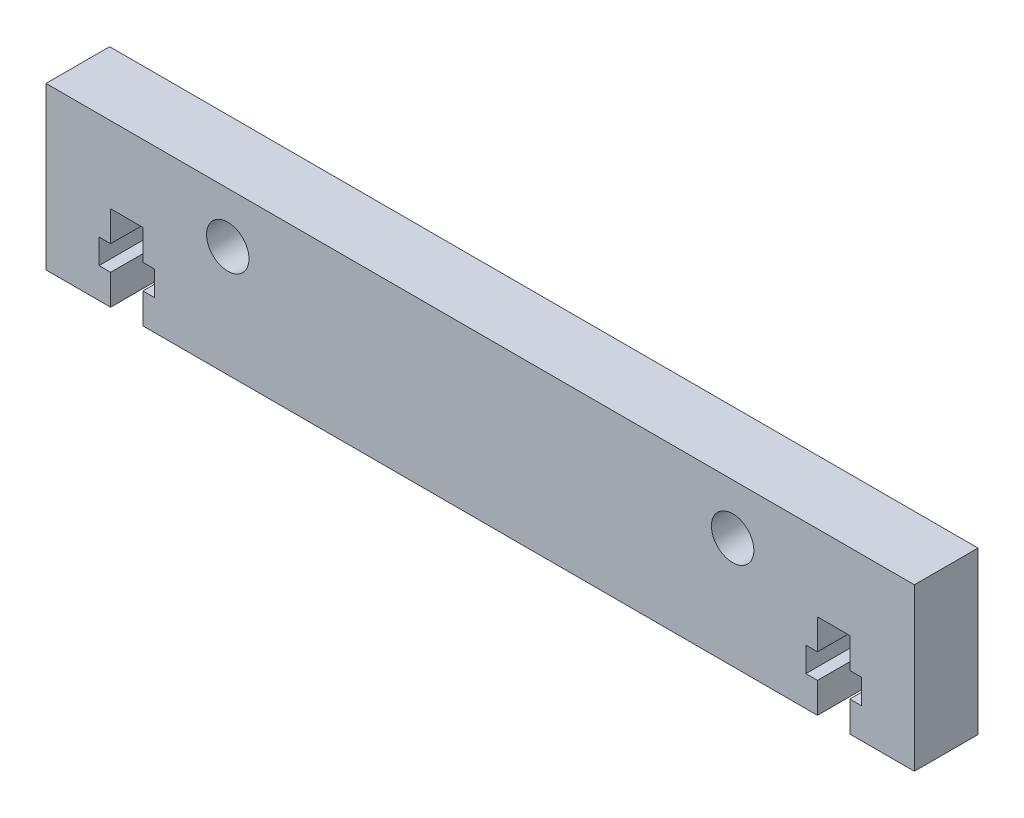
ISO-10303-21;
HEADER;
FILE_DESCRIPTION(('STEP AP214'),'2;1');
FILE_NAME('part.step','',(''),(''),'','','');
FILE_SCHEMA(('AUTOMOTIVE_DESIGN { 1 0 10303 214 1 1 1 1 }'));
ENDSEC;
DATA;
#1=APPLICATION_CONTEXT('core data for automotive mechanical design processes');
#2=APPLICATION_PROTOCOL_DEFINITION('international standard','automotive_design',2000,#1);
#3=PRODUCT_CONTEXT('',#1,'mechanical');
#4=PRODUCT('Part','Part','',(#3));
#5=PRODUCT_RELATED_PRODUCT_CATEGORY('part','',(#4));
#6=PRODUCT_DEFINITION_FORMATION('','',#4);
#7=PRODUCT_DEFINITION_CONTEXT('part definition',#1,'design');
#8=PRODUCT_DEFINITION('design','',#6,#7);
#9=PRODUCT_DEFINITION_SHAPE('','',#8);
#10=(LENGTH_UNIT() NAMED_UNIT(*) SI_UNIT(.MILLI.,.METRE.));
#11=(NAMED_UNIT(*) PLANE_ANGLE_UNIT() SI_UNIT($,.RADIAN.));
#12=(NAMED_UNIT(*) SI_UNIT($,.STERADIAN.) SOLID_ANGLE_UNIT());
#13=UNCERTAINTY_MEASURE_WITH_UNIT(LENGTH_MEASURE(1.E-05),#10,'distance_accuracy_value','');
#14=(GEOMETRIC_REPRESENTATION_CONTEXT(3) GLOBAL_UNCERTAINTY_ASSIGNED_CONTEXT((#13)) GLOBAL_UNIT_ASSIGNED_CONTEXT((#10,
#11,#12)) REPRESENTATION_CONTEXT('',''));
#15=CARTESIAN_POINT('',(0.,0.,0.));
#16=DIRECTION('',(0.,0.,1.));
#17=DIRECTION('',(1.,0.,0.));
#18=AXIS2_PLACEMENT_3D('',#15,#16,#17);
#19=CARTESIAN_POINT('',(0.,0.,6.3));
#20=DIRECTION('',(0.,0.,-1.));
#21=DIRECTION('',(-1.,0.,0.));
#22=AXIS2_PLACEMENT_3D('',#19,#20,#21);
#23=PLANE('',#22);
#24=DIRECTION('',(-1.,0.,0.));
#25=VECTOR('',#24,1.);
#26=CARTESIAN_POINT('',(33.4,3.,6.3));
#27=LINE('',#26,#25);
#28=CARTESIAN_POINT('',(33.4,3.,6.3));
#29=VERTEX_POINT('',#28);
#30=CARTESIAN_POINT('',(32.25,2.99999999999999,6.3));
#31=VERTEX_POINT('',#30);
#32=EDGE_CURVE('E344',#29,#31,#27,.T.);
#33=ORIENTED_EDGE('',*,*,#32,.T.);
#34=DIRECTION('',(0.,1.,0.));
#35=VECTOR('',#34,1.);
#36=CARTESIAN_POINT('',(32.25,2.99999999999999,6.3));
#37=LINE('',#36,#35);
#38=CARTESIAN_POINT('',(32.25,5.45,6.3));
#39=VERTEX_POINT('',#38);
#40=EDGE_CURVE('E160',#31,#39,#37,.T.);
#41=ORIENTED_EDGE('',*,*,#40,.T.);
#42=DIRECTION('',(1.,0.,0.));
#43=VECTOR('',#42,1.);
#44=CARTESIAN_POINT('',(32.25,5.45,6.3));
#45=LINE('',#44,#43);
#46=CARTESIAN_POINT('',(33.4,5.45,6.3));
#47=VERTEX_POINT('',#46);
#48=EDGE_CURVE('E445',#39,#47,#45,.T.);
#49=ORIENTED_EDGE('',*,*,#48,.T.);
#50=DIRECTION('',(0.,1.,0.));
#51=VECTOR('',#50,1.);
#52=CARTESIAN_POINT('',(33.4,5.45,6.3));
#53=LINE('',#52,#51);
#54=CARTESIAN_POINT('',(33.4,8.45,6.3));
#55=VERTEX_POINT('',#54);
#56=EDGE_CURVE('E465',#47,#55,#53,.T.);
#57=ORIENTED_EDGE('',*,*,#56,.T.);
#58=DIRECTION('',(1.,0.,0.));
#59=VECTOR('',#58,1.);
#60=CARTESIAN_POINT('',(33.4,8.45,6.3));
#61=LINE('',#60,#59);
#62=CARTESIAN_POINT('',(36.6,8.45,6.3));
#63=VERTEX_POINT('',#62);
#64=EDGE_CURVE('E461',#55,#63,#61,.T.);
#65=ORIENTED_EDGE('',*,*,#64,.T.);
#66=DIRECTION('',(0.,-1.,0.));
#67=VECTOR('',#66,1.);
#68=CARTESIAN_POINT('',(36.6,8.45,6.3));
#69=LINE('',#68,#67);
#70=CARTESIAN_POINT('',(36.6,5.45,6.3));
#71=VERTEX_POINT('',#70);
#72=EDGE_CURVE('E464',#63,#71,#69,.T.);
#73=ORIENTED_EDGE('',*,*,#72,.T.);
#74=DIRECTION('',(1.,0.,0.));
#75=VECTOR('',#74,1.);
#76=CARTESIAN_POINT('',(36.6,5.45,6.3));
#77=LINE('',#76,#75);
#78=CARTESIAN_POINT('',(37.75,5.44999999999999,6.3));
#79=VERTEX_POINT('',#78);
#80=EDGE_CURVE('E469',#71,#79,#77,.T.);
#81=ORIENTED_EDGE('',*,*,#80,.T.);
#82=DIRECTION('',(0.,-1.,0.));
#83=VECTOR('',#82,1.);
#84=CARTESIAN_POINT('',(37.75,5.44999999999999,6.3));
#85=LINE('',#84,#83);
#86=CARTESIAN_POINT('',(37.75,2.99999999999999,6.3));
#87=VERTEX_POINT('',#86);
#88=EDGE_CURVE('E476',#79,#87,#85,.T.);
#89=ORIENTED_EDGE('',*,*,#88,.T.);
#90=DIRECTION('',(-1.,0.,0.));
#91=VECTOR('',#90,1.);
#92=CARTESIAN_POINT('',(37.75,2.99999999999999,6.3));
#93=LINE('',#92,#91);
#94=CARTESIAN_POINT('',(36.6,3.,6.3));
#95=VERTEX_POINT('',#94);
#96=EDGE_CURVE('E479',#87,#95,#93,.T.);
#97=ORIENTED_EDGE('',*,*,#96,.T.);
#98=DIRECTION('',(0.,-1.,0.));
#99=VECTOR('',#98,1.);
#100=CARTESIAN_POINT('',(36.6,3.,6.3));
#101=LINE('',#100,#99);
#102=CARTESIAN_POINT('',(36.6,0.,6.3));
#103=VERTEX_POINT('',#102);
#104=EDGE_CURVE('E482',#95,#103,#101,.T.);
#105=ORIENTED_EDGE('',*,*,#104,.T.);
#106=DIRECTION('',(1.,0.,0.));
#107=VECTOR('',#106,1.);
#108=CARTESIAN_POINT('',(36.6,0.,6.3));
#109=LINE('',#108,#107);
#110=CARTESIAN_POINT('',(43.,0.,6.3));
#111=VERTEX_POINT('',#110);
#112=EDGE_CURVE('E485',#103,#111,#109,.T.);
#113=ORIENTED_EDGE('',*,*,#112,.T.);
#114=DIRECTION('',(0.,1.,0.));
#115=VECTOR('',#114,1.);
#116=CARTESIAN_POINT('',(43.,0.,6.3));
#117=LINE('',#116,#115);
#118=CARTESIAN_POINT('',(43.,16.,6.3));
#119=VERTEX_POINT('',#118);
#120=EDGE_CURVE('E488',#111,#119,#117,.T.);
#121=ORIENTED_EDGE('',*,*,#120,.T.);
#122=DIRECTION('',(-1.,0.,0.));
#123=VECTOR('',#122,1.);
#124=CARTESIAN_POINT('',(-43.,16.,6.3));
#125=LINE('',#124,#123);
#126=CARTESIAN_POINT('',(-43.,16.,6.3));
#127=VERTEX_POINT('',#126);
#128=EDGE_CURVE('E491',#119,#127,#125,.T.);
#129=ORIENTED_EDGE('',*,*,#128,.T.);
#130=DIRECTION('',(0.,-1.,0.));
#131=VECTOR('',#130,1.);
#132=CARTESIAN_POINT('',(-43.,0.,6.3));
#133=LINE('',#132,#131);
#134=CARTESIAN_POINT('',(-43.,0.,6.3));
#135=VERTEX_POINT('',#134);
#136=EDGE_CURVE('E494',#127,#135,#133,.T.);
#137=ORIENTED_EDGE('',*,*,#136,.T.);
#138=DIRECTION('',(1.,0.,0.));
#139=VECTOR('',#138,1.);
#140=CARTESIAN_POINT('',(-36.6,0.,6.3));
#141=LINE('',#140,#139);
#142=CARTESIAN_POINT('',(-36.6,0.,6.3));
#143=VERTEX_POINT('',#142);
#144=EDGE_CURVE('E497',#135,#143,#141,.T.);
#145=ORIENTED_EDGE('',*,*,#144,.T.);
#146=DIRECTION('',(0.,1.,0.));
#147=VECTOR('',#146,1.);
#148=CARTESIAN_POINT('',(-36.6,3.,6.3));
#149=LINE('',#148,#147);
#150=CARTESIAN_POINT('',(-36.6,3.,6.3));
#151=VERTEX_POINT('',#150);
#152=EDGE_CURVE('E500',#143,#151,#149,.T.);
#153=ORIENTED_EDGE('',*,*,#152,.T.);
#154=DIRECTION('',(-1.,0.,0.));
#155=VECTOR('',#154,1.);
#156=CARTESIAN_POINT('',(-37.75,2.99999999999999,6.3));
#157=LINE('',#156,#155);
#158=CARTESIAN_POINT('',(-37.75,2.99999999999999,6.3));
#159=VERTEX_POINT('',#158);
#160=EDGE_CURVE('E503',#151,#159,#157,.T.);
#161=ORIENTED_EDGE('',*,*,#160,.T.);
#162=DIRECTION('',(0.,1.,0.));
#163=VECTOR('',#162,1.);
#164=CARTESIAN_POINT('',(-37.75,5.44999999999999,6.3));
#165=LINE('',#164,#163);
#166=CARTESIAN_POINT('',(-37.75,5.44999999999999,6.3));
#167=VERTEX_POINT('',#166);
#168=EDGE_CURVE('E506',#159,#167,#165,.T.);
#169=ORIENTED_EDGE('',*,*,#168,.T.);
#170=DIRECTION('',(1.,0.,0.));
#171=VECTOR('',#170,1.);
#172=CARTESIAN_POINT('',(-36.6,5.45,6.3));
#173=LINE('',#172,#171);
#174=CARTESIAN_POINT('',(-36.6,5.45,6.3));
#175=VERTEX_POINT('',#174);
#176=EDGE_CURVE('E509',#167,#175,#173,.T.);
#177=ORIENTED_EDGE('',*,*,#176,.T.);
#178=DIRECTION('',(0.,1.,0.));
#179=VECTOR('',#178,1.);
#180=CARTESIAN_POINT('',(-36.6,8.45,6.3));
#181=LINE('',#180,#179);
#182=CARTESIAN_POINT('',(-36.6,8.45,6.3));
#183=VERTEX_POINT('',#182);
#184=EDGE_CURVE('E512',#175,#183,#181,.T.);
#185=ORIENTED_EDGE('',*,*,#184,.T.);
#186=DIRECTION('',(1.,0.,0.));
#187=VECTOR('',#186,1.);
#188=CARTESIAN_POINT('',(-33.4,8.45,6.3));
#189=LINE('',#188,#187);
#190=CARTESIAN_POINT('',(-33.4,8.45,6.3));
#191=VERTEX_POINT('',#190);
#192=EDGE_CURVE('E515',#183,#191,#189,.T.);
#193=ORIENTED_EDGE('',*,*,#192,.T.);
#194=DIRECTION('',(0.,-1.,0.));
#195=VECTOR('',#194,1.);
#196=CARTESIAN_POINT('',(-33.4,5.45,6.3));
#197=LINE('',#196,#195);
#198=CARTESIAN_POINT('',(-33.4,5.45,6.3));
#199=VERTEX_POINT('',#198);
#200=EDGE_CURVE('E518',#191,#199,#197,.T.);
#201=ORIENTED_EDGE('',*,*,#200,.T.);
#202=DIRECTION('',(1.,0.,0.));
#203=VECTOR('',#202,1.);
#204=CARTESIAN_POINT('',(-32.25,5.45,6.3));
#205=LINE('',#204,#203);
#206=CARTESIAN_POINT('',(-32.25,5.45,6.3));
#207=VERTEX_POINT('',#206);
#208=EDGE_CURVE('E521',#199,#207,#205,.T.);
#209=ORIENTED_EDGE('',*,*,#208,.T.);
#210=DIRECTION('',(0.,-1.,0.));
#211=VECTOR('',#210,1.);
#212=CARTESIAN_POINT('',(-32.25,2.99999999999999,6.3));
#213=LINE('',#212,#211);
#214=CARTESIAN_POINT('',(-32.25,2.99999999999999,6.3));
#215=VERTEX_POINT('',#214);
#216=EDGE_CURVE('E524',#207,#215,#213,.T.);
#217=ORIENTED_EDGE('',*,*,#216,.T.);
#218=DIRECTION('',(-1.,0.,0.));
#219=VECTOR('',#218,1.);
#220=CARTESIAN_POINT('',(-33.4,3.,6.3));
#221=LINE('',#220,#219);
#222=CARTESIAN_POINT('',(-33.4,3.,6.3));
#223=VERTEX_POINT('',#222);
#224=EDGE_CURVE('E239',#215,#223,#221,.T.);
#225=ORIENTED_EDGE('',*,*,#224,.T.);
#226=DIRECTION('',(0.,-1.,0.));
#227=VECTOR('',#226,1.);
#228=CARTESIAN_POINT('',(-33.4,0.,6.3));
#229=LINE('',#228,#227);
#230=CARTESIAN_POINT('',(-33.4,0.,6.3));
#231=VERTEX_POINT('',#230);
#232=EDGE_CURVE('E233',#223,#231,#229,.T.);
#233=ORIENTED_EDGE('',*,*,#232,.T.);
#234=DIRECTION('',(1.,0.,0.));
#235=VECTOR('',#234,1.);
#236=CARTESIAN_POINT('',(33.4,0.,6.3));
#237=LINE('',#236,#235);
#238=CARTESIAN_POINT('',(33.4,0.,6.3));
#239=VERTEX_POINT('',#238);
#240=EDGE_CURVE('E237',#231,#239,#237,.T.);
#241=ORIENTED_EDGE('',*,*,#240,.T.);
#242=DIRECTION('',(0.,1.,0.));
#243=VECTOR('',#242,1.);
#244=CARTESIAN_POINT('',(33.4,0.,6.3));
#245=LINE('',#244,#243);
#246=EDGE_CURVE('E57',#239,#29,#245,.T.);
#247=ORIENTED_EDGE('',*,*,#246,.T.);
#248=EDGE_LOOP('',(#33,#41,#49,#57,#65,#73,#81,#89,#97,#105,#113,#121,#129,#137,#145,#153,#161,
#169,#177,#185,#193,#201,#209,#217,#225,#233,#241,#247));
#249=FACE_BOUND('',#248,.T.);
#250=CARTESIAN_POINT('',(-25.,11.,6.3));
#251=DIRECTION('',(0.,0.,1.));
#252=DIRECTION('',(1.,0.,0.));
#253=AXIS2_PLACEMENT_3D('',#250,#251,#252);
#254=CIRCLE('',#253,2.1);
#255=CARTESIAN_POINT('',(-22.9,11.,6.3));
#256=VERTEX_POINT('',#255);
#257=EDGE_CURVE('E266',#256,#256,#254,.T.);
#258=ORIENTED_EDGE('',*,*,#257,.F.);
#259=EDGE_LOOP('',(#258));
#260=FACE_BOUND('',#259,.T.);
#261=CARTESIAN_POINT('',(25.,11.,6.3));
#262=DIRECTION('',(0.,0.,1.));
#263=DIRECTION('',(-1.,0.,0.));
#264=AXIS2_PLACEMENT_3D('',#261,#262,#263);
#265=CIRCLE('',#264,2.1);
#266=CARTESIAN_POINT('',(22.9,11.,6.3));
#267=VERTEX_POINT('',#266);
#268=EDGE_CURVE('E567',#267,#267,#265,.T.);
#269=ORIENTED_EDGE('',*,*,#268,.F.);
#270=EDGE_LOOP('',(#269));
#271=FACE_BOUND('',#270,.T.);
#272=ADVANCED_FACE('F39',(#249,#260,#271),#23,.F.);
#273=CARTESIAN_POINT('',(0.,0.,0.));
#274=DIRECTION('',(0.,0.,-1.));
#275=DIRECTION('',(-1.,0.,0.));
#276=AXIS2_PLACEMENT_3D('',#273,#274,#275);
#277=PLANE('',#276);
#278=CARTESIAN_POINT('',(-25.,11.,0.));
#279=DIRECTION('',(0.,0.,1.));
#280=DIRECTION('',(1.,0.,0.));
#281=AXIS2_PLACEMENT_3D('',#278,#279,#280);
#282=CIRCLE('',#281,2.1);
#283=CARTESIAN_POINT('',(-22.9,11.,0.));
#284=VERTEX_POINT('',#283);
#285=EDGE_CURVE('E574',#284,#284,#282,.T.);
#286=ORIENTED_EDGE('',*,*,#285,.T.);
#287=EDGE_LOOP('',(#286));
#288=FACE_BOUND('',#287,.T.);
#289=DIRECTION('',(-1.,0.,0.));
#290=VECTOR('',#289,1.);
#291=CARTESIAN_POINT('',(33.4,3.,0.));
#292=LINE('',#291,#290);
#293=CARTESIAN_POINT('',(33.4,3.,0.));
#294=VERTEX_POINT('',#293);
#295=CARTESIAN_POINT('',(32.25,2.99999999999999,0.));
#296=VERTEX_POINT('',#295);
#297=EDGE_CURVE('E261',#294,#296,#292,.T.);
#298=ORIENTED_EDGE('',*,*,#297,.F.);
#299=DIRECTION('',(0.,1.,0.));
#300=VECTOR('',#299,1.);
#301=CARTESIAN_POINT('',(33.4,0.,0.));
#302=LINE('',#301,#300);
#303=CARTESIAN_POINT('',(33.4,0.,0.));
#304=VERTEX_POINT('',#303);
#305=EDGE_CURVE('E152',#304,#294,#302,.T.);
#306=ORIENTED_EDGE('',*,*,#305,.F.);
#307=DIRECTION('',(1.,0.,0.));
#308=VECTOR('',#307,1.);
#309=CARTESIAN_POINT('',(33.4,0.,0.));
#310=LINE('',#309,#308);
#311=CARTESIAN_POINT('',(-33.4,0.,0.));
#312=VERTEX_POINT('',#311);
#313=EDGE_CURVE('E146',#312,#304,#310,.T.);
#314=ORIENTED_EDGE('',*,*,#313,.F.);
#315=DIRECTION('',(0.,-1.,0.));
#316=VECTOR('',#315,1.);
#317=CARTESIAN_POINT('',(-33.4,0.,0.));
#318=LINE('',#317,#316);
#319=CARTESIAN_POINT('',(-33.4,3.,0.));
#320=VERTEX_POINT('',#319);
#321=EDGE_CURVE('E248',#320,#312,#318,.T.);
#322=ORIENTED_EDGE('',*,*,#321,.F.);
#323=DIRECTION('',(-1.,0.,0.));
#324=VECTOR('',#323,1.);
#325=CARTESIAN_POINT('',(-33.4,3.,0.));
#326=LINE('',#325,#324);
#327=CARTESIAN_POINT('',(-32.25,2.99999999999999,0.));
#328=VERTEX_POINT('',#327);
#329=EDGE_CURVE('E335',#328,#320,#326,.T.);
#330=ORIENTED_EDGE('',*,*,#329,.F.);
#331=DIRECTION('',(0.,-1.,0.));
#332=VECTOR('',#331,1.);
#333=CARTESIAN_POINT('',(-32.25,2.99999999999999,0.));
#334=LINE('',#333,#332);
#335=CARTESIAN_POINT('',(-32.25,5.45,0.));
#336=VERTEX_POINT('',#335);
#337=EDGE_CURVE('E332',#336,#328,#334,.T.);
#338=ORIENTED_EDGE('',*,*,#337,.F.);
#339=DIRECTION('',(1.,0.,0.));
#340=VECTOR('',#339,1.);
#341=CARTESIAN_POINT('',(-32.25,5.45,0.));
#342=LINE('',#341,#340);
#343=CARTESIAN_POINT('',(-33.4,5.45,0.));
#344=VERTEX_POINT('',#343);
#345=EDGE_CURVE('E329',#344,#336,#342,.T.);
#346=ORIENTED_EDGE('',*,*,#345,.F.);
#347=DIRECTION('',(0.,-1.,0.));
#348=VECTOR('',#347,1.);
#349=CARTESIAN_POINT('',(-33.4,5.45,0.));
#350=LINE('',#349,#348);
#351=CARTESIAN_POINT('',(-33.4,8.45,0.));
#352=VERTEX_POINT('',#351);
#353=EDGE_CURVE('E326',#352,#344,#350,.T.);
#354=ORIENTED_EDGE('',*,*,#353,.F.);
#355=DIRECTION('',(1.,0.,0.));
#356=VECTOR('',#355,1.);
#357=CARTESIAN_POINT('',(-33.4,8.45,0.));
#358=LINE('',#357,#356);
#359=CARTESIAN_POINT('',(-36.6,8.45,0.));
#360=VERTEX_POINT('',#359);
#361=EDGE_CURVE('E323',#360,#352,#358,.T.);
#362=ORIENTED_EDGE('',*,*,#361,.F.);
#363=DIRECTION('',(0.,1.,0.));
#364=VECTOR('',#363,1.);
#365=CARTESIAN_POINT('',(-36.6,8.45,0.));
#366=LINE('',#365,#364);
#367=CARTESIAN_POINT('',(-36.6,5.45,0.));
#368=VERTEX_POINT('',#367);
#369=EDGE_CURVE('E320',#368,#360,#366,.T.);
#370=ORIENTED_EDGE('',*,*,#369,.F.);
#371=DIRECTION('',(1.,0.,0.));
#372=VECTOR('',#371,1.);
#373=CARTESIAN_POINT('',(-36.6,5.45,0.));
#374=LINE('',#373,#372);
#375=CARTESIAN_POINT('',(-37.75,5.44999999999999,0.));
#376=VERTEX_POINT('',#375);
#377=EDGE_CURVE('E317',#376,#368,#374,.T.);
#378=ORIENTED_EDGE('',*,*,#377,.F.);
#379=DIRECTION('',(0.,1.,0.));
#380=VECTOR('',#379,1.);
#381=CARTESIAN_POINT('',(-37.75,5.44999999999999,0.));
#382=LINE('',#381,#380);
#383=CARTESIAN_POINT('',(-37.75,2.99999999999999,0.));
#384=VERTEX_POINT('',#383);
#385=EDGE_CURVE('E314',#384,#376,#382,.T.);
#386=ORIENTED_EDGE('',*,*,#385,.F.);
#387=DIRECTION('',(-1.,0.,0.));
#388=VECTOR('',#387,1.);
#389=CARTESIAN_POINT('',(-37.75,2.99999999999999,0.));
#390=LINE('',#389,#388);
#391=CARTESIAN_POINT('',(-36.6,3.,0.));
#392=VERTEX_POINT('',#391);
#393=EDGE_CURVE('E311',#392,#384,#390,.T.);
#394=ORIENTED_EDGE('',*,*,#393,.F.);
#395=DIRECTION('',(0.,1.,0.));
#396=VECTOR('',#395,1.);
#397=CARTESIAN_POINT('',(-36.6,3.,0.));
#398=LINE('',#397,#396);
#399=CARTESIAN_POINT('',(-36.6,0.,0.));
#400=VERTEX_POINT('',#399);
#401=EDGE_CURVE('E308',#400,#392,#398,.T.);
#402=ORIENTED_EDGE('',*,*,#401,.F.);
#403=DIRECTION('',(1.,0.,0.));
#404=VECTOR('',#403,1.);
#405=CARTESIAN_POINT('',(-36.6,0.,0.));
#406=LINE('',#405,#404);
#407=CARTESIAN_POINT('',(-43.,0.,0.));
#408=VERTEX_POINT('',#407);
#409=EDGE_CURVE('E305',#408,#400,#406,.T.);
#410=ORIENTED_EDGE('',*,*,#409,.F.);
#411=DIRECTION('',(0.,-1.,0.));
#412=VECTOR('',#411,1.);
#413=CARTESIAN_POINT('',(-43.,0.,0.));
#414=LINE('',#413,#412);
#415=CARTESIAN_POINT('',(-43.,16.,0.));
#416=VERTEX_POINT('',#415);
#417=EDGE_CURVE('E302',#416,#408,#414,.T.);
#418=ORIENTED_EDGE('',*,*,#417,.F.);
#419=DIRECTION('',(-1.,0.,0.));
#420=VECTOR('',#419,1.);
#421=CARTESIAN_POINT('',(-43.,16.,0.));
#422=LINE('',#421,#420);
#423=CARTESIAN_POINT('',(43.,16.,0.));
#424=VERTEX_POINT('',#423);
#425=EDGE_CURVE('E299',#424,#416,#422,.T.);
#426=ORIENTED_EDGE('',*,*,#425,.F.);
#427=DIRECTION('',(0.,1.,0.));
#428=VECTOR('',#427,1.);
#429=CARTESIAN_POINT('',(43.,0.,0.));
#430=LINE('',#429,#428);
#431=CARTESIAN_POINT('',(43.,0.,0.));
#432=VERTEX_POINT('',#431);
#433=EDGE_CURVE('E296',#432,#424,#430,.T.);
#434=ORIENTED_EDGE('',*,*,#433,.F.);
#435=DIRECTION('',(1.,0.,0.));
#436=VECTOR('',#435,1.);
#437=CARTESIAN_POINT('',(36.6,0.,0.));
#438=LINE('',#437,#436);
#439=CARTESIAN_POINT('',(36.6,0.,0.));
#440=VERTEX_POINT('',#439);
#441=EDGE_CURVE('E293',#440,#432,#438,.T.);
#442=ORIENTED_EDGE('',*,*,#441,.F.);
#443=DIRECTION('',(0.,-1.,0.));
#444=VECTOR('',#443,1.);
#445=CARTESIAN_POINT('',(36.6,3.,0.));
#446=LINE('',#445,#444);
#447=CARTESIAN_POINT('',(36.6,3.,0.));
#448=VERTEX_POINT('',#447);
#449=EDGE_CURVE('E290',#448,#440,#446,.T.);
#450=ORIENTED_EDGE('',*,*,#449,.F.);
#451=DIRECTION('',(-1.,0.,0.));
#452=VECTOR('',#451,1.);
#453=CARTESIAN_POINT('',(37.75,2.99999999999999,0.));
#454=LINE('',#453,#452);
#455=CARTESIAN_POINT('',(37.75,2.99999999999999,0.));
#456=VERTEX_POINT('',#455);
#457=EDGE_CURVE('E287',#456,#448,#454,.T.);
#458=ORIENTED_EDGE('',*,*,#457,.F.);
#459=DIRECTION('',(0.,-1.,0.));
#460=VECTOR('',#459,1.);
#461=CARTESIAN_POINT('',(37.75,5.44999999999999,0.));
#462=LINE('',#461,#460);
#463=CARTESIAN_POINT('',(37.75,5.44999999999999,0.));
#464=VERTEX_POINT('',#463);
#465=EDGE_CURVE('E284',#464,#456,#462,.T.);
#466=ORIENTED_EDGE('',*,*,#465,.F.);
#467=DIRECTION('',(1.,0.,0.));
#468=VECTOR('',#467,1.);
#469=CARTESIAN_POINT('',(36.6,5.45,0.));
#470=LINE('',#469,#468);
#471=CARTESIAN_POINT('',(36.6,5.45,0.));
#472=VERTEX_POINT('',#471);
#473=EDGE_CURVE('E281',#472,#464,#470,.T.);
#474=ORIENTED_EDGE('',*,*,#473,.F.);
#475=DIRECTION('',(0.,-1.,0.));
#476=VECTOR('',#475,1.);
#477=CARTESIAN_POINT('',(36.6,8.45,0.));
#478=LINE('',#477,#476);
#479=CARTESIAN_POINT('',(36.6,8.45,0.));
#480=VERTEX_POINT('',#479);
#481=EDGE_CURVE('E278',#480,#472,#478,.T.);
#482=ORIENTED_EDGE('',*,*,#481,.F.);
#483=DIRECTION('',(1.,0.,0.));
#484=VECTOR('',#483,1.);
#485=CARTESIAN_POINT('',(33.4,8.45,0.));
#486=LINE('',#485,#484);
#487=CARTESIAN_POINT('',(33.4,8.45,0.));
#488=VERTEX_POINT('',#487);
#489=EDGE_CURVE('E275',#488,#480,#486,.T.);
#490=ORIENTED_EDGE('',*,*,#489,.F.);
#491=DIRECTION('',(0.,1.,0.));
#492=VECTOR('',#491,1.);
#493=CARTESIAN_POINT('',(33.4,5.45,0.));
#494=LINE('',#493,#492);
#495=CARTESIAN_POINT('',(33.4,5.45,0.));
#496=VERTEX_POINT('',#495);
#497=EDGE_CURVE('E272',#496,#488,#494,.T.);
#498=ORIENTED_EDGE('',*,*,#497,.F.);
#499=DIRECTION('',(1.,0.,0.));
#500=VECTOR('',#499,1.);
#501=CARTESIAN_POINT('',(32.25,5.45,0.));
#502=LINE('',#501,#500);
#503=CARTESIAN_POINT('',(32.25,5.45,0.));
#504=VERTEX_POINT('',#503);
#505=EDGE_CURVE('E269',#504,#496,#502,.T.);
#506=ORIENTED_EDGE('',*,*,#505,.F.);
#507=DIRECTION('',(0.,1.,0.));
#508=VECTOR('',#507,1.);
#509=CARTESIAN_POINT('',(32.25,2.99999999999999,0.));
#510=LINE('',#509,#508);
#511=EDGE_CURVE('E265',#296,#504,#510,.T.);
#512=ORIENTED_EDGE('',*,*,#511,.F.);
#513=EDGE_LOOP('',(#298,#306,#314,#322,#330,#338,#346,#354,#362,#370,#378,#386,#394,#402,#410,
#418,#426,#434,#442,#450,#458,#466,#474,#482,#490,#498,#506,#512));
#514=FACE_BOUND('',#513,.T.);
#515=CARTESIAN_POINT('',(25.,11.,0.));
#516=DIRECTION('',(0.,0.,1.));
#517=DIRECTION('',(-1.,0.,0.));
#518=AXIS2_PLACEMENT_3D('',#515,#516,#517);
#519=CIRCLE('',#518,2.1);
#520=CARTESIAN_POINT('',(22.9,11.,0.));
#521=VERTEX_POINT('',#520);
#522=EDGE_CURVE('E570',#521,#521,#519,.T.);
#523=ORIENTED_EDGE('',*,*,#522,.T.);
#524=EDGE_LOOP('',(#523));
#525=FACE_BOUND('',#524,.T.);
#526=ADVANCED_FACE('F449',(#288,#514,#525),#277,.T.);
#527=CARTESIAN_POINT('',(33.4,3.,6.3));
#528=DIRECTION('',(0.,-1.,0.));
#529=DIRECTION('',(1.,0.,0.));
#530=AXIS2_PLACEMENT_3D('',#527,#528,#529);
#531=PLANE('',#530);
#532=ORIENTED_EDGE('',*,*,#297,.T.);
#533=DIRECTION('',(0.,0.,-1.));
#534=VECTOR('',#533,1.);
#535=CARTESIAN_POINT('',(32.25,2.99999999999999,6.3));
#536=LINE('',#535,#534);
#537=EDGE_CURVE('E11',#31,#296,#536,.T.);
#538=ORIENTED_EDGE('',*,*,#537,.F.);
#539=ORIENTED_EDGE('',*,*,#32,.F.);
#540=DIRECTION('',(0.,0.,-1.));
#541=VECTOR('',#540,1.);
#542=CARTESIAN_POINT('',(33.4,3.,6.3));
#543=LINE('',#542,#541);
#544=EDGE_CURVE('E257',#29,#294,#543,.T.);
#545=ORIENTED_EDGE('',*,*,#544,.T.);
#546=EDGE_LOOP('',(#532,#538,#539,#545));
#547=FACE_BOUND('',#546,.T.);
#548=ADVANCED_FACE('F41',(#547),#531,.F.);
#549=CARTESIAN_POINT('',(32.25,2.99999999999999,6.3));
#550=DIRECTION('',(-1.,0.,0.));
#551=DIRECTION('',(0.,-1.,0.));
#552=AXIS2_PLACEMENT_3D('',#549,#550,#551);
#553=PLANE('',#552);
#554=ORIENTED_EDGE('',*,*,#511,.T.);
#555=DIRECTION('',(0.,0.,-1.));
#556=VECTOR('',#555,1.);
#557=CARTESIAN_POINT('',(32.25,5.45,6.3));
#558=LINE('',#557,#556);
#559=EDGE_CURVE('E49',#39,#504,#558,.T.);
#560=ORIENTED_EDGE('',*,*,#559,.F.);
#561=ORIENTED_EDGE('',*,*,#40,.F.);
#562=ORIENTED_EDGE('',*,*,#537,.T.);
#563=EDGE_LOOP('',(#554,#560,#561,#562));
#564=FACE_BOUND('',#563,.T.);
#565=ADVANCED_FACE('F834',(#564),#553,.F.);
#566=CARTESIAN_POINT('',(32.25,5.45,6.3));
#567=DIRECTION('',(0.,1.,0.));
#568=DIRECTION('',(-1.,0.,0.));
#569=AXIS2_PLACEMENT_3D('',#566,#567,#568);
#570=PLANE('',#569);
#571=ORIENTED_EDGE('',*,*,#505,.T.);
#572=DIRECTION('',(0.,0.,-1.));
#573=VECTOR('',#572,1.);
#574=CARTESIAN_POINT('',(33.4,5.45,6.3));
#575=LINE('',#574,#573);
#576=EDGE_CURVE('E435',#47,#496,#575,.T.);
#577=ORIENTED_EDGE('',*,*,#576,.F.);
#578=ORIENTED_EDGE('',*,*,#48,.F.);
#579=ORIENTED_EDGE('',*,*,#559,.T.);
#580=EDGE_LOOP('',(#571,#577,#578,#579));
#581=FACE_BOUND('',#580,.T.);
#582=ADVANCED_FACE('F443',(#581),#570,.F.);
#583=CARTESIAN_POINT('',(33.4,5.45,6.3));
#584=DIRECTION('',(-1.,0.,0.));
#585=DIRECTION('',(0.,-1.,0.));
#586=AXIS2_PLACEMENT_3D('',#583,#584,#585);
#587=PLANE('',#586);
#588=ORIENTED_EDGE('',*,*,#497,.T.);
#589=DIRECTION('',(0.,0.,-1.));
#590=VECTOR('',#589,1.);
#591=CARTESIAN_POINT('',(33.4,8.45,6.3));
#592=LINE('',#591,#590);
#593=EDGE_CURVE('E431',#55,#488,#592,.T.);
#594=ORIENTED_EDGE('',*,*,#593,.F.);
#595=ORIENTED_EDGE('',*,*,#56,.F.);
#596=ORIENTED_EDGE('',*,*,#576,.T.);
#597=EDGE_LOOP('',(#588,#594,#595,#596));
#598=FACE_BOUND('',#597,.T.);
#599=ADVANCED_FACE('F455',(#598),#587,.F.);
#600=CARTESIAN_POINT('',(33.4,8.45,6.3));
#601=DIRECTION('',(0.,1.,0.));
#602=DIRECTION('',(-1.,0.,0.));
#603=AXIS2_PLACEMENT_3D('',#600,#601,#602);
#604=PLANE('',#603);
#605=ORIENTED_EDGE('',*,*,#489,.T.);
#606=DIRECTION('',(0.,0.,-1.));
#607=VECTOR('',#606,1.);
#608=CARTESIAN_POINT('',(36.6,8.45,6.3));
#609=LINE('',#608,#607);
#610=EDGE_CURVE('E427',#63,#480,#609,.T.);
#611=ORIENTED_EDGE('',*,*,#610,.F.);
#612=ORIENTED_EDGE('',*,*,#64,.F.);
#613=ORIENTED_EDGE('',*,*,#593,.T.);
#614=EDGE_LOOP('',(#605,#611,#612,#613));
#615=FACE_BOUND('',#614,.T.);
#616=ADVANCED_FACE('F459',(#615),#604,.F.);
#617=CARTESIAN_POINT('',(36.6,8.45,6.3));
#618=DIRECTION('',(1.,0.,0.));
#619=DIRECTION('',(0.,1.,0.));
#620=AXIS2_PLACEMENT_3D('',#617,#618,#619);
#621=PLANE('',#620);
#622=ORIENTED_EDGE('',*,*,#481,.T.);
#623=DIRECTION('',(0.,0.,-1.));
#624=VECTOR('',#623,1.);
#625=CARTESIAN_POINT('',(36.6,5.45,6.3));
#626=LINE('',#625,#624);
#627=EDGE_CURVE('E423',#71,#472,#626,.T.);
#628=ORIENTED_EDGE('',*,*,#627,.F.);
#629=ORIENTED_EDGE('',*,*,#72,.F.);
#630=ORIENTED_EDGE('',*,*,#610,.T.);
#631=EDGE_LOOP('',(#622,#628,#629,#630));
#632=FACE_BOUND('',#631,.T.);
#633=ADVANCED_FACE('F799',(#632),#621,.F.);
#634=CARTESIAN_POINT('',(36.6,5.45,6.3));
#635=DIRECTION('',(0.,1.,0.));
#636=DIRECTION('',(-1.,0.,0.));
#637=AXIS2_PLACEMENT_3D('',#634,#635,#636);
#638=PLANE('',#637);
#639=ORIENTED_EDGE('',*,*,#473,.T.);
#640=DIRECTION('',(0.,0.,-1.));
#641=VECTOR('',#640,1.);
#642=CARTESIAN_POINT('',(37.75,5.44999999999999,6.3));
#643=LINE('',#642,#641);
#644=EDGE_CURVE('E419',#79,#464,#643,.T.);
#645=ORIENTED_EDGE('',*,*,#644,.F.);
#646=ORIENTED_EDGE('',*,*,#80,.F.);
#647=ORIENTED_EDGE('',*,*,#627,.T.);
#648=EDGE_LOOP('',(#639,#645,#646,#647));
#649=FACE_BOUND('',#648,.T.);
#650=ADVANCED_FACE('F789',(#649),#638,.F.);
#651=CARTESIAN_POINT('',(37.75,5.44999999999999,6.3));
#652=DIRECTION('',(1.,0.,0.));
#653=DIRECTION('',(0.,0.,-1.));
#654=AXIS2_PLACEMENT_3D('',#651,#652,#653);
#655=PLANE('',#654);
#656=ORIENTED_EDGE('',*,*,#465,.T.);
#657=DIRECTION('',(0.,0.,-1.));
#658=VECTOR('',#657,1.);
#659=CARTESIAN_POINT('',(37.75,2.99999999999999,6.3));
#660=LINE('',#659,#658);
#661=EDGE_CURVE('E415',#87,#456,#660,.T.);
#662=ORIENTED_EDGE('',*,*,#661,.F.);
#663=ORIENTED_EDGE('',*,*,#88,.F.);
#664=ORIENTED_EDGE('',*,*,#644,.T.);
#665=EDGE_LOOP('',(#656,#662,#663,#664));
#666=FACE_BOUND('',#665,.T.);
#667=ADVANCED_FACE('F779',(#666),#655,.F.);
#668=CARTESIAN_POINT('',(37.75,2.99999999999999,6.3));
#669=DIRECTION('',(0.,-1.,0.));
#670=DIRECTION('',(1.,0.,0.));
#671=AXIS2_PLACEMENT_3D('',#668,#669,#670);
#672=PLANE('',#671);
#673=ORIENTED_EDGE('',*,*,#457,.T.);
#674=DIRECTION('',(0.,0.,-1.));
#675=VECTOR('',#674,1.);
#676=CARTESIAN_POINT('',(36.6,3.,6.3));
#677=LINE('',#676,#675);
#678=EDGE_CURVE('E411',#95,#448,#677,.T.);
#679=ORIENTED_EDGE('',*,*,#678,.F.);
#680=ORIENTED_EDGE('',*,*,#96,.F.);
#681=ORIENTED_EDGE('',*,*,#661,.T.);
#682=EDGE_LOOP('',(#673,#679,#680,#681));
#683=FACE_BOUND('',#682,.T.);
#684=ADVANCED_FACE('F769',(#683),#672,.F.);
#685=CARTESIAN_POINT('',(36.6,3.,6.3));
#686=DIRECTION('',(1.,0.,0.));
#687=DIRECTION('',(0.,1.,0.));
#688=AXIS2_PLACEMENT_3D('',#685,#686,#687);
#689=PLANE('',#688);
#690=ORIENTED_EDGE('',*,*,#449,.T.);
#691=DIRECTION('',(0.,0.,-1.));
#692=VECTOR('',#691,1.);
#693=CARTESIAN_POINT('',(36.6,0.,6.3));
#694=LINE('',#693,#692);
#695=EDGE_CURVE('E407',#103,#440,#694,.T.);
#696=ORIENTED_EDGE('',*,*,#695,.F.);
#697=ORIENTED_EDGE('',*,*,#104,.F.);
#698=ORIENTED_EDGE('',*,*,#678,.T.);
#699=EDGE_LOOP('',(#690,#696,#697,#698));
#700=FACE_BOUND('',#699,.T.);
#701=ADVANCED_FACE('F759',(#700),#689,.F.);
#702=CARTESIAN_POINT('',(36.6,0.,6.3));
#703=DIRECTION('',(0.,1.,0.));
#704=DIRECTION('',(-1.,0.,0.));
#705=AXIS2_PLACEMENT_3D('',#702,#703,#704);
#706=PLANE('',#705);
#707=ORIENTED_EDGE('',*,*,#441,.T.);
#708=DIRECTION('',(0.,0.,-1.));
#709=VECTOR('',#708,1.);
#710=CARTESIAN_POINT('',(43.,0.,6.3));
#711=LINE('',#710,#709);
#712=EDGE_CURVE('E403',#111,#432,#711,.T.);
#713=ORIENTED_EDGE('',*,*,#712,.F.);
#714=ORIENTED_EDGE('',*,*,#112,.F.);
#715=ORIENTED_EDGE('',*,*,#695,.T.);
#716=EDGE_LOOP('',(#707,#713,#714,#715));
#717=FACE_BOUND('',#716,.T.);
#718=ADVANCED_FACE('F749',(#717),#706,.F.);
#719=CARTESIAN_POINT('',(43.,0.,6.3));
#720=DIRECTION('',(-1.,0.,0.));
#721=DIRECTION('',(0.,0.,1.));
#722=AXIS2_PLACEMENT_3D('',#719,#720,#721);
#723=PLANE('',#722);
#724=ORIENTED_EDGE('',*,*,#433,.T.);
#725=DIRECTION('',(0.,0.,-1.));
#726=VECTOR('',#725,1.);
#727=CARTESIAN_POINT('',(43.,16.,6.3));
#728=LINE('',#727,#726);
#729=EDGE_CURVE('E399',#119,#424,#728,.T.);
#730=ORIENTED_EDGE('',*,*,#729,.F.);
#731=ORIENTED_EDGE('',*,*,#120,.F.);
#732=ORIENTED_EDGE('',*,*,#712,.T.);
#733=EDGE_LOOP('',(#724,#730,#731,#732));
#734=FACE_BOUND('',#733,.T.);
#735=ADVANCED_FACE('F739',(#734),#723,.F.);
#736=CARTESIAN_POINT('',(-43.,16.,6.3));
#737=DIRECTION('',(0.,-1.,0.));
#738=DIRECTION('',(0.,0.,-1.));
#739=AXIS2_PLACEMENT_3D('',#736,#737,#738);
#740=PLANE('',#739);
#741=ORIENTED_EDGE('',*,*,#425,.T.);
#742=DIRECTION('',(0.,0.,-1.));
#743=VECTOR('',#742,1.);
#744=CARTESIAN_POINT('',(-43.,16.,6.3));
#745=LINE('',#744,#743);
#746=EDGE_CURVE('E395',#127,#416,#745,.T.);
#747=ORIENTED_EDGE('',*,*,#746,.F.);
#748=ORIENTED_EDGE('',*,*,#128,.F.);
#749=ORIENTED_EDGE('',*,*,#729,.T.);
#750=EDGE_LOOP('',(#741,#747,#748,#749));
#751=FACE_BOUND('',#750,.T.);
#752=ADVANCED_FACE('F729',(#751),#740,.F.);
#753=CARTESIAN_POINT('',(-43.,0.,6.3));
#754=DIRECTION('',(1.,0.,0.));
#755=DIRECTION('',(0.,0.,-1.));
#756=AXIS2_PLACEMENT_3D('',#753,#754,#755);
#757=PLANE('',#756);
#758=ORIENTED_EDGE('',*,*,#417,.T.);
#759=DIRECTION('',(0.,0.,-1.));
#760=VECTOR('',#759,1.);
#761=CARTESIAN_POINT('',(-43.,0.,6.3));
#762=LINE('',#761,#760);
#763=EDGE_CURVE('E391',#135,#408,#762,.T.);
#764=ORIENTED_EDGE('',*,*,#763,.F.);
#765=ORIENTED_EDGE('',*,*,#136,.F.);
#766=ORIENTED_EDGE('',*,*,#746,.T.);
#767=EDGE_LOOP('',(#758,#764,#765,#766));
#768=FACE_BOUND('',#767,.T.);
#769=ADVANCED_FACE('F719',(#768),#757,.F.);
#770=CARTESIAN_POINT('',(-36.6,0.,6.3));
#771=DIRECTION('',(0.,1.,0.));
#772=DIRECTION('',(-1.,0.,0.));
#773=AXIS2_PLACEMENT_3D('',#770,#771,#772);
#774=PLANE('',#773);
#775=ORIENTED_EDGE('',*,*,#409,.T.);
#776=DIRECTION('',(0.,0.,-1.));
#777=VECTOR('',#776,1.);
#778=CARTESIAN_POINT('',(-36.6,0.,6.3));
#779=LINE('',#778,#777);
#780=EDGE_CURVE('E387',#143,#400,#779,.T.);
#781=ORIENTED_EDGE('',*,*,#780,.F.);
#782=ORIENTED_EDGE('',*,*,#144,.F.);
#783=ORIENTED_EDGE('',*,*,#763,.T.);
#784=EDGE_LOOP('',(#775,#781,#782,#783));
#785=FACE_BOUND('',#784,.T.);
#786=ADVANCED_FACE('F709',(#785),#774,.F.);
#787=CARTESIAN_POINT('',(-36.6,3.,6.3));
#788=DIRECTION('',(-1.,0.,0.));
#789=DIRECTION('',(0.,-1.,0.));
#790=AXIS2_PLACEMENT_3D('',#787,#788,#789);
#791=PLANE('',#790);
#792=ORIENTED_EDGE('',*,*,#401,.T.);
#793=DIRECTION('',(0.,0.,-1.));
#794=VECTOR('',#793,1.);
#795=CARTESIAN_POINT('',(-36.6,3.,6.3));
#796=LINE('',#795,#794);
#797=EDGE_CURVE('E383',#151,#392,#796,.T.);
#798=ORIENTED_EDGE('',*,*,#797,.F.);
#799=ORIENTED_EDGE('',*,*,#152,.F.);
#800=ORIENTED_EDGE('',*,*,#780,.T.);
#801=EDGE_LOOP('',(#792,#798,#799,#800));
#802=FACE_BOUND('',#801,.T.);
#803=ADVANCED_FACE('F699',(#802),#791,.F.);
#804=CARTESIAN_POINT('',(-37.75,2.99999999999999,6.3));
#805=DIRECTION('',(0.,-1.,0.));
#806=DIRECTION('',(1.,0.,0.));
#807=AXIS2_PLACEMENT_3D('',#804,#805,#806);
#808=PLANE('',#807);
#809=ORIENTED_EDGE('',*,*,#393,.T.);
#810=DIRECTION('',(0.,0.,-1.));
#811=VECTOR('',#810,1.);
#812=CARTESIAN_POINT('',(-37.75,2.99999999999999,6.3));
#813=LINE('',#812,#811);
#814=EDGE_CURVE('E379',#159,#384,#813,.T.);
#815=ORIENTED_EDGE('',*,*,#814,.F.);
#816=ORIENTED_EDGE('',*,*,#160,.F.);
#817=ORIENTED_EDGE('',*,*,#797,.T.);
#818=EDGE_LOOP('',(#809,#815,#816,#817));
#819=FACE_BOUND('',#818,.T.);
#820=ADVANCED_FACE('F689',(#819),#808,.F.);
#821=CARTESIAN_POINT('',(-37.75,5.44999999999999,6.3));
#822=DIRECTION('',(-1.,0.,0.));
#823=DIRECTION('',(0.,0.,1.));
#824=AXIS2_PLACEMENT_3D('',#821,#822,#823);
#825=PLANE('',#824);
#826=ORIENTED_EDGE('',*,*,#385,.T.);
#827=DIRECTION('',(0.,0.,-1.));
#828=VECTOR('',#827,1.);
#829=CARTESIAN_POINT('',(-37.75,5.44999999999999,6.3));
#830=LINE('',#829,#828);
#831=EDGE_CURVE('E375',#167,#376,#830,.T.);
#832=ORIENTED_EDGE('',*,*,#831,.F.);
#833=ORIENTED_EDGE('',*,*,#168,.F.);
#834=ORIENTED_EDGE('',*,*,#814,.T.);
#835=EDGE_LOOP('',(#826,#832,#833,#834));
#836=FACE_BOUND('',#835,.T.);
#837=ADVANCED_FACE('F679',(#836),#825,.F.);
#838=CARTESIAN_POINT('',(-36.6,5.45,6.3));
#839=DIRECTION('',(0.,1.,0.));
#840=DIRECTION('',(-1.,0.,0.));
#841=AXIS2_PLACEMENT_3D('',#838,#839,#840);
#842=PLANE('',#841);
#843=ORIENTED_EDGE('',*,*,#377,.T.);
#844=DIRECTION('',(0.,0.,-1.));
#845=VECTOR('',#844,1.);
#846=CARTESIAN_POINT('',(-36.6,5.45,6.3));
#847=LINE('',#846,#845);
#848=EDGE_CURVE('E371',#175,#368,#847,.T.);
#849=ORIENTED_EDGE('',*,*,#848,.F.);
#850=ORIENTED_EDGE('',*,*,#176,.F.);
#851=ORIENTED_EDGE('',*,*,#831,.T.);
#852=EDGE_LOOP('',(#843,#849,#850,#851));
#853=FACE_BOUND('',#852,.T.);
#854=ADVANCED_FACE('F669',(#853),#842,.F.);
#855=CARTESIAN_POINT('',(-36.6,8.45,6.3));
#856=DIRECTION('',(-1.,0.,0.));
#857=DIRECTION('',(0.,-1.,0.));
#858=AXIS2_PLACEMENT_3D('',#855,#856,#857);
#859=PLANE('',#858);
#860=ORIENTED_EDGE('',*,*,#369,.T.);
#861=DIRECTION('',(0.,0.,-1.));
#862=VECTOR('',#861,1.);
#863=CARTESIAN_POINT('',(-36.6,8.45,6.3));
#864=LINE('',#863,#862);
#865=EDGE_CURVE('E367',#183,#360,#864,.T.);
#866=ORIENTED_EDGE('',*,*,#865,.F.);
#867=ORIENTED_EDGE('',*,*,#184,.F.);
#868=ORIENTED_EDGE('',*,*,#848,.T.);
#869=EDGE_LOOP('',(#860,#866,#867,#868));
#870=FACE_BOUND('',#869,.T.);
#871=ADVANCED_FACE('F659',(#870),#859,.F.);
#872=CARTESIAN_POINT('',(-33.4,8.45,6.3));
#873=DIRECTION('',(0.,1.,0.));
#874=DIRECTION('',(-1.,0.,0.));
#875=AXIS2_PLACEMENT_3D('',#872,#873,#874);
#876=PLANE('',#875);
#877=ORIENTED_EDGE('',*,*,#361,.T.);
#878=DIRECTION('',(0.,0.,-1.));
#879=VECTOR('',#878,1.);
#880=CARTESIAN_POINT('',(-33.4,8.45,6.3));
#881=LINE('',#880,#879);
#882=EDGE_CURVE('E363',#191,#352,#881,.T.);
#883=ORIENTED_EDGE('',*,*,#882,.F.);
#884=ORIENTED_EDGE('',*,*,#192,.F.);
#885=ORIENTED_EDGE('',*,*,#865,.T.);
#886=EDGE_LOOP('',(#877,#883,#884,#885));
#887=FACE_BOUND('',#886,.T.);
#888=ADVANCED_FACE('F649',(#887),#876,.F.);
#889=CARTESIAN_POINT('',(-33.4,5.45,6.3));
#890=DIRECTION('',(1.,0.,0.));
#891=DIRECTION('',(0.,1.,0.));
#892=AXIS2_PLACEMENT_3D('',#889,#890,#891);
#893=PLANE('',#892);
#894=ORIENTED_EDGE('',*,*,#353,.T.);
#895=DIRECTION('',(0.,0.,-1.));
#896=VECTOR('',#895,1.);
#897=CARTESIAN_POINT('',(-33.4,5.45,6.3));
#898=LINE('',#897,#896);
#899=EDGE_CURVE('E359',#199,#344,#898,.T.);
#900=ORIENTED_EDGE('',*,*,#899,.F.);
#901=ORIENTED_EDGE('',*,*,#200,.F.);
#902=ORIENTED_EDGE('',*,*,#882,.T.);
#903=EDGE_LOOP('',(#894,#900,#901,#902));
#904=FACE_BOUND('',#903,.T.);
#905=ADVANCED_FACE('F639',(#904),#893,.F.);
#906=CARTESIAN_POINT('',(-32.25,5.45,6.3));
#907=DIRECTION('',(0.,1.,0.));
#908=DIRECTION('',(-1.,0.,0.));
#909=AXIS2_PLACEMENT_3D('',#906,#907,#908);
#910=PLANE('',#909);
#911=ORIENTED_EDGE('',*,*,#345,.T.);
#912=DIRECTION('',(0.,0.,-1.));
#913=VECTOR('',#912,1.);
#914=CARTESIAN_POINT('',(-32.25,5.45,6.3));
#915=LINE('',#914,#913);
#916=EDGE_CURVE('E355',#207,#336,#915,.T.);
#917=ORIENTED_EDGE('',*,*,#916,.F.);
#918=ORIENTED_EDGE('',*,*,#208,.F.);
#919=ORIENTED_EDGE('',*,*,#899,.T.);
#920=EDGE_LOOP('',(#911,#917,#918,#919));
#921=FACE_BOUND('',#920,.T.);
#922=ADVANCED_FACE('F630',(#921),#910,.F.);
#923=CARTESIAN_POINT('',(-32.25,2.99999999999999,6.3));
#924=DIRECTION('',(1.,0.,0.));
#925=DIRECTION('',(0.,1.,0.));
#926=AXIS2_PLACEMENT_3D('',#923,#924,#925);
#927=PLANE('',#926);
#928=ORIENTED_EDGE('',*,*,#337,.T.);
#929=DIRECTION('',(0.,0.,-1.));
#930=VECTOR('',#929,1.);
#931=CARTESIAN_POINT('',(-32.25,2.99999999999999,6.3));
#932=LINE('',#931,#930);
#933=EDGE_CURVE('E351',#215,#328,#932,.T.);
#934=ORIENTED_EDGE('',*,*,#933,.F.);
#935=ORIENTED_EDGE('',*,*,#216,.F.);
#936=ORIENTED_EDGE('',*,*,#916,.T.);
#937=EDGE_LOOP('',(#928,#934,#935,#936));
#938=FACE_BOUND('',#937,.T.);
#939=ADVANCED_FACE('F532',(#938),#927,.F.);
#940=CARTESIAN_POINT('',(-33.4,3.,6.3));
#941=DIRECTION('',(0.,-1.,0.));
#942=DIRECTION('',(1.,0.,0.));
#943=AXIS2_PLACEMENT_3D('',#940,#941,#942);
#944=PLANE('',#943);
#945=ORIENTED_EDGE('',*,*,#329,.T.);
#946=DIRECTION('',(0.,0.,-1.));
#947=VECTOR('',#946,1.);
#948=CARTESIAN_POINT('',(-33.4,3.,6.3));
#949=LINE('',#948,#947);
#950=EDGE_CURVE('E250',#223,#320,#949,.T.);
#951=ORIENTED_EDGE('',*,*,#950,.F.);
#952=ORIENTED_EDGE('',*,*,#224,.F.);
#953=ORIENTED_EDGE('',*,*,#933,.T.);
#954=EDGE_LOOP('',(#945,#951,#952,#953));
#955=FACE_BOUND('',#954,.T.);
#956=ADVANCED_FACE('F536',(#955),#944,.F.);
#957=CARTESIAN_POINT('',(-33.4,0.,6.3));
#958=DIRECTION('',(1.,0.,0.));
#959=DIRECTION('',(0.,0.,-1.));
#960=AXIS2_PLACEMENT_3D('',#957,#958,#959);
#961=PLANE('',#960);
#962=ORIENTED_EDGE('',*,*,#321,.T.);
#963=DIRECTION('',(0.,0.,-1.));
#964=VECTOR('',#963,1.);
#965=CARTESIAN_POINT('',(-33.4,0.,6.3));
#966=LINE('',#965,#964);
#967=EDGE_CURVE('E245',#231,#312,#966,.T.);
#968=ORIENTED_EDGE('',*,*,#967,.F.);
#969=ORIENTED_EDGE('',*,*,#232,.F.);
#970=ORIENTED_EDGE('',*,*,#950,.T.);
#971=EDGE_LOOP('',(#962,#968,#969,#970));
#972=FACE_BOUND('',#971,.T.);
#973=ADVANCED_FACE('F246',(#972),#961,.F.);
#974=CARTESIAN_POINT('',(33.4,0.,6.3));
#975=DIRECTION('',(0.,1.,0.));
#976=DIRECTION('',(0.,0.,1.));
#977=AXIS2_PLACEMENT_3D('',#974,#975,#976);
#978=PLANE('',#977);
#979=ORIENTED_EDGE('',*,*,#313,.T.);
#980=DIRECTION('',(0.,0.,-1.));
#981=VECTOR('',#980,1.);
#982=CARTESIAN_POINT('',(33.4,0.,6.3));
#983=LINE('',#982,#981);
#984=EDGE_CURVE('E251',#239,#304,#983,.T.);
#985=ORIENTED_EDGE('',*,*,#984,.F.);
#986=ORIENTED_EDGE('',*,*,#240,.F.);
#987=ORIENTED_EDGE('',*,*,#967,.T.);
#988=EDGE_LOOP('',(#979,#985,#986,#987));
#989=FACE_BOUND('',#988,.T.);
#990=ADVANCED_FACE('F253',(#989),#978,.F.);
#991=CARTESIAN_POINT('',(33.4,0.,6.3));
#992=DIRECTION('',(-1.,0.,0.));
#993=DIRECTION('',(0.,0.,1.));
#994=AXIS2_PLACEMENT_3D('',#991,#992,#993);
#995=PLANE('',#994);
#996=ORIENTED_EDGE('',*,*,#305,.T.);
#997=ORIENTED_EDGE('',*,*,#544,.F.);
#998=ORIENTED_EDGE('',*,*,#246,.F.);
#999=ORIENTED_EDGE('',*,*,#984,.T.);
#1000=EDGE_LOOP('',(#996,#997,#998,#999));
#1001=FACE_BOUND('',#1000,.T.);
#1002=ADVANCED_FACE('F540',(#1001),#995,.F.);
#1003=CARTESIAN_POINT('',(-25.,11.,6.3));
#1004=DIRECTION('',(0.,0.,-1.));
#1005=DIRECTION('',(-1.,0.,0.));
#1006=AXIS2_PLACEMENT_3D('',#1003,#1004,#1005);
#1007=CYLINDRICAL_SURFACE('',#1006,2.1);
#1008=ORIENTED_EDGE('',*,*,#257,.T.);
#1009=EDGE_LOOP('',(#1008));
#1010=FACE_BOUND('',#1009,.T.);
#1011=ORIENTED_EDGE('',*,*,#285,.F.);
#1012=EDGE_LOOP('',(#1011));
#1013=FACE_BOUND('',#1012,.T.);
#1014=ADVANCED_FACE('F542',(#1010,#1013),#1007,.F.);
#1015=CARTESIAN_POINT('',(25.,11.,6.3));
#1016=DIRECTION('',(0.,0.,-1.));
#1017=DIRECTION('',(-1.,0.,0.));
#1018=AXIS2_PLACEMENT_3D('',#1015,#1016,#1017);
#1019=CYLINDRICAL_SURFACE('',#1018,2.1);
#1020=ORIENTED_EDGE('',*,*,#268,.T.);
#1021=EDGE_LOOP('',(#1020));
#1022=FACE_BOUND('',#1021,.T.);
#1023=ORIENTED_EDGE('',*,*,#522,.F.);
#1024=EDGE_LOOP('',(#1023));
#1025=FACE_BOUND('',#1024,.T.);
#1026=ADVANCED_FACE('F548',(#1022,#1025),#1019,.F.);
#1027=CLOSED_SHELL('',(#272,#526,#548,#565,#582,#599,#616,#633,#650,#667,#684,#701,#718,#735,
#752,#769,#786,#803,#820,#837,#854,#871,#888,#905,#922,#939,#956,#973,#990,#1002,#1014,#1026));
#1028=MANIFOLD_SOLID_BREP('B2',#1027);
#1029=ADVANCED_BREP_SHAPE_REPRESENTATION('',(#18,#1028),#14);
#1030=SHAPE_DEFINITION_REPRESENTATION(#9,#1029);
ENDSEC;
END-ISO-10303-21;
